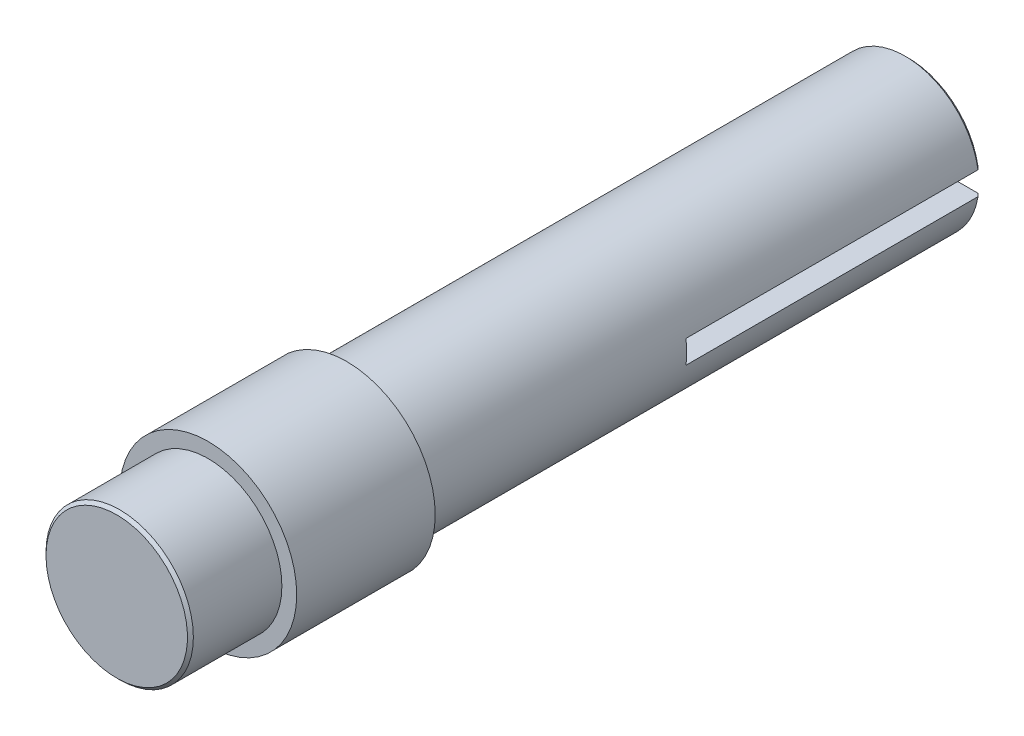
ISO-10303-21;
HEADER;
FILE_DESCRIPTION(('STEP AP214'),'2;1');
FILE_NAME('part.step','',(''),(''),'','','');
FILE_SCHEMA(('AUTOMOTIVE_DESIGN { 1 0 10303 214 1 1 1 1 }'));
ENDSEC;
DATA;
#1=APPLICATION_CONTEXT('core data for automotive mechanical design processes');
#2=APPLICATION_PROTOCOL_DEFINITION('international standard','automotive_design',2000,#1);
#3=PRODUCT_CONTEXT('',#1,'mechanical');
#4=PRODUCT('Part','Part','',(#3));
#5=PRODUCT_RELATED_PRODUCT_CATEGORY('part','',(#4));
#6=PRODUCT_DEFINITION_FORMATION('','',#4);
#7=PRODUCT_DEFINITION_CONTEXT('part definition',#1,'design');
#8=PRODUCT_DEFINITION('design','',#6,#7);
#9=PRODUCT_DEFINITION_SHAPE('','',#8);
#10=(LENGTH_UNIT() NAMED_UNIT(*) SI_UNIT(.MILLI.,.METRE.));
#11=(NAMED_UNIT(*) PLANE_ANGLE_UNIT() SI_UNIT($,.RADIAN.));
#12=(NAMED_UNIT(*) SI_UNIT($,.STERADIAN.) SOLID_ANGLE_UNIT());
#13=UNCERTAINTY_MEASURE_WITH_UNIT(LENGTH_MEASURE(1.E-05),#10,'distance_accuracy_value','');
#14=(GEOMETRIC_REPRESENTATION_CONTEXT(3) GLOBAL_UNCERTAINTY_ASSIGNED_CONTEXT((#13)) GLOBAL_UNIT_ASSIGNED_CONTEXT((#10,
#11,#12)) REPRESENTATION_CONTEXT('',''));
#15=CARTESIAN_POINT('',(0.,0.,0.));
#16=DIRECTION('',(0.,0.,1.));
#17=DIRECTION('',(1.,0.,0.));
#18=AXIS2_PLACEMENT_3D('',#15,#16,#17);
#19=CARTESIAN_POINT('',(0.,0.,68.1355));
#20=DIRECTION('',(0.,0.,1.));
#21=DIRECTION('',(1.,0.,0.));
#22=AXIS2_PLACEMENT_3D('',#19,#20,#21);
#23=PLANE('',#22);
#24=CARTESIAN_POINT('',(0.,0.,68.1354999999257));
#25=DIRECTION('',(0.,0.,-1.));
#26=DIRECTION('',(-1.,0.,0.));
#27=AXIS2_PLACEMENT_3D('',#24,#25,#26);
#28=CIRCLE('',#27,6.08965000003536);
#29=CARTESIAN_POINT('',(-6.08965000003536,0.,68.1354999999257));
#30=VERTEX_POINT('',#29);
#31=EDGE_CURVE('E19',#30,#30,#28,.T.);
#32=ORIENTED_EDGE('',*,*,#31,.F.);
#33=EDGE_LOOP('',(#32));
#34=FACE_BOUND('',#33,.T.);
#35=ADVANCED_FACE('F16',(#34),#23,.T.);
#36=CARTESIAN_POINT('',(0.,0.,67.8815000000554));
#37=DIRECTION('',(0.,0.,-1.));
#38=DIRECTION('',(-1.,0.,0.));
#39=AXIS2_PLACEMENT_3D('',#36,#37,#38);
#40=CONICAL_SURFACE('',#39,6.34364999990567,0.785398163397448);
#41=ORIENTED_EDGE('',*,*,#31,.T.);
#42=EDGE_LOOP('',(#41));
#43=FACE_BOUND('',#42,.T.);
#44=CARTESIAN_POINT('',(0.,0.,67.8815));
#45=DIRECTION('',(0.,0.,1.));
#46=DIRECTION('',(1.,0.,0.));
#47=AXIS2_PLACEMENT_3D('',#44,#45,#46);
#48=CIRCLE('',#47,6.34365);
#49=CARTESIAN_POINT('',(6.34365,0.,67.8815));
#50=VERTEX_POINT('',#49);
#51=EDGE_CURVE('E103',#50,#50,#48,.F.);
#52=ORIENTED_EDGE('',*,*,#51,.F.);
#53=EDGE_LOOP('',(#52));
#54=FACE_BOUND('',#53,.T.);
#55=ADVANCED_FACE('F469',(#43,#54),#40,.T.);
#56=CARTESIAN_POINT('',(0.,0.,60.2615));
#57=DIRECTION('',(0.,0.,1.));
#58=DIRECTION('',(1.,0.,0.));
#59=AXIS2_PLACEMENT_3D('',#56,#57,#58);
#60=CYLINDRICAL_SURFACE('',#59,6.34365);
#61=CARTESIAN_POINT('',(0.,0.,60.2615));
#62=DIRECTION('',(0.,0.,1.));
#63=DIRECTION('',(1.,0.,0.));
#64=AXIS2_PLACEMENT_3D('',#61,#62,#63);
#65=CIRCLE('',#64,6.34365);
#66=CARTESIAN_POINT('',(6.34365,0.,60.2615));
#67=VERTEX_POINT('',#66);
#68=EDGE_CURVE('E257',#67,#67,#65,.F.);
#69=ORIENTED_EDGE('',*,*,#68,.F.);
#70=EDGE_LOOP('',(#69));
#71=FACE_BOUND('',#70,.T.);
#72=ORIENTED_EDGE('',*,*,#51,.T.);
#73=EDGE_LOOP('',(#72));
#74=FACE_BOUND('',#73,.T.);
#75=ADVANCED_FACE('F246',(#71,#74),#60,.T.);
#76=CARTESIAN_POINT('',(0.,0.,0.));
#77=DIRECTION('',(0.,0.,-1.));
#78=DIRECTION('',(-1.,0.,0.));
#79=AXIS2_PLACEMENT_3D('',#76,#77,#78);
#80=CONICAL_SURFACE('',#79,4.24180000004526,0.785398163397448);
#81=CARTESIAN_POINT('',(0.,0.,0.));
#82=DIRECTION('',(0.,0.,-1.));
#83=DIRECTION('',(-1.,0.,0.));
#84=AXIS2_PLACEMENT_3D('',#81,#82,#83);
#85=CIRCLE('',#84,4.24180000004526);
#86=CARTESIAN_POINT('',(4.12224056070739,-0.999999999999999,5.04555482413226E-12));
#87=VERTEX_POINT('',#86);
#88=CARTESIAN_POINT('',(-4.12224056070739,-0.999999999999999,5.04564364376599E-12));
#89=VERTEX_POINT('',#88);
#90=EDGE_CURVE('E97',#87,#89,#85,.T.);
#91=ORIENTED_EDGE('',*,*,#90,.T.);
#92=CARTESIAN_POINT('',(-3.86038195523382,-0.999999999993576,0.254000000000811));
#93=CARTESIAN_POINT('',(-3.90406608771924,-0.999999999996787,0.211708967101962));
#94=CARTESIAN_POINT('',(-3.94772970457568,-0.999999999998928,0.169396783833055));
#95=CARTESIAN_POINT('',(-4.03501590639787,-1.00000000000107,0.0847301171688703));
#96=CARTESIAN_POINT('',(-4.07863849136422,-1.00000000000107,0.042375633774205));
#97=CARTESIAN_POINT('',(-4.12224056070219,-0.999999999999999,1.00961965345783E-11));
#98=B_SPLINE_CURVE_WITH_KNOTS('',3,(#92,#93,#94,#95,#96,#97),.UNSPECIFIED.,.F.,.F.,(4,2,4),(0.,
0.182404743934218,0.364809485223962),.UNSPECIFIED.);
#99=CARTESIAN_POINT('',(-3.86038195521659,-0.999999999999999,0.25400000000233));
#100=VERTEX_POINT('',#99);
#101=EDGE_CURVE('E91',#100,#89,#98,.T.);
#102=ORIENTED_EDGE('',*,*,#101,.F.);
#103=CARTESIAN_POINT('',(0.,0.,0.25399999999999));
#104=DIRECTION('',(0.,0.,-1.));
#105=DIRECTION('',(-1.,0.,0.));
#106=AXIS2_PLACEMENT_3D('',#103,#104,#105);
#107=CIRCLE('',#106,3.9878);
#108=CARTESIAN_POINT('',(3.86038195521659,-0.999999999999999,0.25400000000233));
#109=VERTEX_POINT('',#108);
#110=EDGE_CURVE('E94',#100,#109,#107,.F.);
#111=ORIENTED_EDGE('',*,*,#110,.T.);
#112=CARTESIAN_POINT('',(4.12224056069958,-0.999999999995552,7.39641308948803E-12));
#113=CARTESIAN_POINT('',(4.0786384913623,-0.999999999997775,0.0423756337722108));
#114=CARTESIAN_POINT('',(4.03501590639682,-0.999999999999258,0.0847301171677749));
#115=CARTESIAN_POINT('',(3.94772970457674,-1.00000000000074,0.169396783834143));
#116=CARTESIAN_POINT('',(3.90406608772155,-1.00000000000074,0.211708967104335));
#117=CARTESIAN_POINT('',(3.86038195523756,-0.999999999999999,0.254000000004662));
#118=B_SPLINE_CURVE_WITH_KNOTS('',3,(#112,#113,#114,#115,#116,#117),.UNSPECIFIED.,.F.,.F.,(4,2,
4),(0.,0.182404741289746,0.364809485223961),.UNSPECIFIED.);
#119=EDGE_CURVE('E102',#87,#109,#118,.T.);
#120=ORIENTED_EDGE('',*,*,#119,.F.);
#121=EDGE_LOOP('',(#91,#102,#111,#120));
#122=FACE_BOUND('',#121,.T.);
#123=ADVANCED_FACE('F93',(#122),#80,.F.);
#124=CARTESIAN_POINT('',(0.,0.,60.2615));
#125=DIRECTION('',(0.,0.,1.));
#126=DIRECTION('',(1.,0.,0.));
#127=AXIS2_PLACEMENT_3D('',#124,#125,#126);
#128=PLANE('',#127);
#129=CARTESIAN_POINT('',(0.,0.,60.2615));
#130=DIRECTION('',(0.,0.,-1.));
#131=DIRECTION('',(-1.,0.,0.));
#132=AXIS2_PLACEMENT_3D('',#129,#130,#131);
#133=CIRCLE('',#132,7.62);
#134=CARTESIAN_POINT('',(-7.62,0.,60.2615));
#135=VERTEX_POINT('',#134);
#136=EDGE_CURVE('E210',#135,#135,#133,.T.);
#137=ORIENTED_EDGE('',*,*,#136,.F.);
#138=EDGE_LOOP('',(#137));
#139=FACE_BOUND('',#138,.T.);
#140=ORIENTED_EDGE('',*,*,#68,.T.);
#141=EDGE_LOOP('',(#140));
#142=FACE_BOUND('',#141,.T.);
#143=ADVANCED_FACE('F238',(#139,#142),#128,.T.);
#144=CARTESIAN_POINT('',(0.,0.,28.575));
#145=DIRECTION('',(0.,0.,-1.));
#146=DIRECTION('',(-1.,0.,0.));
#147=AXIS2_PLACEMENT_3D('',#144,#145,#146);
#148=PLANE('',#147);
#149=CARTESIAN_POINT('',(0.,0.,28.575));
#150=DIRECTION('',(0.,0.,-1.));
#151=DIRECTION('',(-1.,0.,0.));
#152=AXIS2_PLACEMENT_3D('',#149,#150,#151);
#153=CIRCLE('',#152,3.9878);
#154=CARTESIAN_POINT('',(-3.9878,0.,28.575));
#155=VERTEX_POINT('',#154);
#156=EDGE_CURVE('E202',#155,#155,#153,.T.);
#157=ORIENTED_EDGE('',*,*,#156,.T.);
#158=EDGE_LOOP('',(#157));
#159=FACE_BOUND('',#158,.T.);
#160=ADVANCED_FACE('F232',(#159),#148,.T.);
#161=CARTESIAN_POINT('',(0.,0.,0.));
#162=DIRECTION('',(0.,0.,-1.));
#163=DIRECTION('',(-1.,0.,0.));
#164=AXIS2_PLACEMENT_3D('',#161,#162,#163);
#165=CONICAL_SURFACE('',#164,4.24180000004526,0.785398163397448);
#166=CARTESIAN_POINT('',(0.,0.,0.));
#167=DIRECTION('',(0.,0.,-1.));
#168=DIRECTION('',(-1.,0.,0.));
#169=AXIS2_PLACEMENT_3D('',#166,#167,#168);
#170=CIRCLE('',#169,4.24180000004526);
#171=CARTESIAN_POINT('',(-4.12224056070739,1.,5.04557822775395E-12));
#172=VERTEX_POINT('',#171);
#173=CARTESIAN_POINT('',(4.12224056070739,0.999999999999998,5.04566130836449E-12));
#174=VERTEX_POINT('',#173);
#175=EDGE_CURVE('E199',#172,#174,#170,.T.);
#176=ORIENTED_EDGE('',*,*,#175,.T.);
#177=CARTESIAN_POINT('',(3.86038195523382,0.999999999993575,0.254000000000811));
#178=CARTESIAN_POINT('',(3.90406608771924,0.999999999996787,0.211708967101961));
#179=CARTESIAN_POINT('',(3.94772970457568,0.999999999998927,0.169396783833055));
#180=CARTESIAN_POINT('',(4.03501590639787,1.00000000000107,0.0847301171688699));
#181=CARTESIAN_POINT('',(4.07863849136422,1.00000000000107,0.042375633774205));
#182=CARTESIAN_POINT('',(4.12224056070219,0.999999999999998,1.00966775679742E-11));
#183=B_SPLINE_CURVE_WITH_KNOTS('',3,(#177,#178,#179,#180,#181,#182),.UNSPECIFIED.,.F.,.F.,(4,2,
4),(0.,0.182404743934218,0.364809485223961),.UNSPECIFIED.);
#184=CARTESIAN_POINT('',(3.86038195521659,0.999999999999998,0.254000000002329));
#185=VERTEX_POINT('',#184);
#186=EDGE_CURVE('E220',#185,#174,#183,.T.);
#187=ORIENTED_EDGE('',*,*,#186,.F.);
#188=CARTESIAN_POINT('',(0.,0.,0.25399999999999));
#189=DIRECTION('',(0.,0.,-1.));
#190=DIRECTION('',(-1.,0.,0.));
#191=AXIS2_PLACEMENT_3D('',#188,#189,#190);
#192=CIRCLE('',#191,3.9878);
#193=CARTESIAN_POINT('',(-3.86038195521659,1.,0.25400000000233));
#194=VERTEX_POINT('',#193);
#195=EDGE_CURVE('E205',#185,#194,#192,.F.);
#196=ORIENTED_EDGE('',*,*,#195,.T.);
#197=CARTESIAN_POINT('',(-4.12224056069958,0.999999999995553,7.39622466692726E-12));
#198=CARTESIAN_POINT('',(-4.0786384913623,0.999999999997776,0.0423756337722106));
#199=CARTESIAN_POINT('',(-4.03501590639682,0.999999999999258,0.0847301171677748));
#200=CARTESIAN_POINT('',(-3.94772970457674,1.00000000000074,0.169396783834143));
#201=CARTESIAN_POINT('',(-3.90406608772155,1.00000000000074,0.211708967104334));
#202=CARTESIAN_POINT('',(-3.86038195523756,1.,0.254000000004661));
#203=B_SPLINE_CURVE_WITH_KNOTS('',3,(#197,#198,#199,#200,#201,#202),.UNSPECIFIED.,.F.,.F.,(4,2,
4),(0.,0.182404741289746,0.36480948522396),.UNSPECIFIED.);
#204=EDGE_CURVE('E110',#172,#194,#203,.T.);
#205=ORIENTED_EDGE('',*,*,#204,.F.);
#206=EDGE_LOOP('',(#176,#187,#196,#205));
#207=FACE_BOUND('',#206,.T.);
#208=ADVANCED_FACE('F226',(#207),#165,.F.);
#209=CARTESIAN_POINT('',(0.,0.,0.));
#210=DIRECTION('',(0.,0.,1.));
#211=DIRECTION('',(1.,0.,0.));
#212=AXIS2_PLACEMENT_3D('',#209,#210,#211);
#213=PLANE('',#212);
#214=DIRECTION('',(1.,0.,0.));
#215=VECTOR('',#214,1.);
#216=CARTESIAN_POINT('',(12.7,-0.999999999999999,0.));
#217=LINE('',#216,#215);
#218=CARTESIAN_POINT('',(-6.00698236401157,-0.999999999999999,0.));
#219=VERTEX_POINT('',#218);
#220=EDGE_CURVE('E117',#219,#89,#217,.T.);
#221=ORIENTED_EDGE('',*,*,#220,.T.);
#222=ORIENTED_EDGE('',*,*,#90,.F.);
#223=DIRECTION('',(1.,0.,0.));
#224=VECTOR('',#223,1.);
#225=CARTESIAN_POINT('',(12.7,-0.999999999999999,0.));
#226=LINE('',#225,#224);
#227=CARTESIAN_POINT('',(6.00698236401157,-0.999999999999999,0.));
#228=VERTEX_POINT('',#227);
#229=EDGE_CURVE('E178',#87,#228,#226,.T.);
#230=ORIENTED_EDGE('',*,*,#229,.T.);
#231=CARTESIAN_POINT('',(0.,0.,0.));
#232=DIRECTION('',(0.,0.,1.));
#233=DIRECTION('',(1.,0.,0.));
#234=AXIS2_PLACEMENT_3D('',#231,#232,#233);
#235=CIRCLE('',#234,6.08964999992168);
#236=EDGE_CURVE('E179',#219,#228,#235,.T.);
#237=ORIENTED_EDGE('',*,*,#236,.F.);
#238=EDGE_LOOP('',(#221,#222,#230,#237));
#239=FACE_BOUND('',#238,.T.);
#240=ADVANCED_FACE('F231',(#239),#213,.F.);
#241=CARTESIAN_POINT('',(0.,0.,68.1355));
#242=DIRECTION('',(0.,0.,-1.));
#243=DIRECTION('',(-1.,0.,0.));
#244=AXIS2_PLACEMENT_3D('',#241,#242,#243);
#245=CYLINDRICAL_SURFACE('',#244,7.62);
#246=CARTESIAN_POINT('',(0.,0.,48.3362));
#247=DIRECTION('',(0.,0.,-1.));
#248=DIRECTION('',(-1.,0.,0.));
#249=AXIS2_PLACEMENT_3D('',#246,#247,#248);
#250=CIRCLE('',#249,7.62);
#251=CARTESIAN_POINT('',(-7.62,0.,48.3362));
#252=VERTEX_POINT('',#251);
#253=EDGE_CURVE('E164',#252,#252,#250,.F.);
#254=ORIENTED_EDGE('',*,*,#253,.T.);
#255=EDGE_LOOP('',(#254));
#256=FACE_BOUND('',#255,.T.);
#257=ORIENTED_EDGE('',*,*,#136,.T.);
#258=EDGE_LOOP('',(#257));
#259=FACE_BOUND('',#258,.T.);
#260=ADVANCED_FACE('F421',(#256,#259),#245,.T.);
#261=CARTESIAN_POINT('',(0.,0.,25.4));
#262=DIRECTION('',(0.,0.,-1.));
#263=DIRECTION('',(-1.,0.,0.));
#264=AXIS2_PLACEMENT_3D('',#261,#262,#263);
#265=PLANE('',#264);
#266=DIRECTION('',(-1.,0.,0.));
#267=VECTOR('',#266,1.);
#268=CARTESIAN_POINT('',(12.7,0.999999999999996,25.4));
#269=LINE('',#268,#267);
#270=CARTESIAN_POINT('',(3.86038195519563,0.999999999999998,25.4));
#271=VERTEX_POINT('',#270);
#272=CARTESIAN_POINT('',(6.2643351859954,0.999999999999997,25.4));
#273=VERTEX_POINT('',#272);
#274=EDGE_CURVE('E277',#271,#273,#269,.F.);
#275=ORIENTED_EDGE('',*,*,#274,.T.);
#276=CARTESIAN_POINT('',(0.,0.,25.4));
#277=DIRECTION('',(0.,0.,-1.));
#278=DIRECTION('',(-1.,0.,0.));
#279=AXIS2_PLACEMENT_3D('',#276,#277,#278);
#280=CIRCLE('',#279,6.34365);
#281=CARTESIAN_POINT('',(6.2643351859954,-0.999999999999998,25.4));
#282=VERTEX_POINT('',#281);
#283=EDGE_CURVE('E208',#273,#282,#280,.T.);
#284=ORIENTED_EDGE('',*,*,#283,.T.);
#285=DIRECTION('',(1.,0.,0.));
#286=VECTOR('',#285,1.);
#287=CARTESIAN_POINT('',(12.7,-0.999999999999999,25.4));
#288=LINE('',#287,#286);
#289=CARTESIAN_POINT('',(3.86038195519563,-0.999999999999999,25.4));
#290=VERTEX_POINT('',#289);
#291=EDGE_CURVE('E168',#282,#290,#288,.F.);
#292=ORIENTED_EDGE('',*,*,#291,.T.);
#293=CARTESIAN_POINT('',(0.,0.,25.4));
#294=DIRECTION('',(0.,0.,-1.));
#295=DIRECTION('',(-1.,0.,0.));
#296=AXIS2_PLACEMENT_3D('',#293,#294,#295);
#297=CIRCLE('',#296,3.9878);
#298=EDGE_CURVE('E206',#290,#271,#297,.F.);
#299=ORIENTED_EDGE('',*,*,#298,.T.);
#300=EDGE_LOOP('',(#275,#284,#292,#299));
#301=FACE_BOUND('',#300,.T.);
#302=ADVANCED_FACE('F327',(#301),#265,.T.);
#303=CARTESIAN_POINT('',(0.,0.,28.575));
#304=DIRECTION('',(0.,0.,-1.));
#305=DIRECTION('',(-1.,0.,0.));
#306=AXIS2_PLACEMENT_3D('',#303,#304,#305);
#307=CYLINDRICAL_SURFACE('',#306,3.9878);
#308=ORIENTED_EDGE('',*,*,#156,.F.);
#309=EDGE_LOOP('',(#308));
#310=FACE_BOUND('',#309,.T.);
#311=CARTESIAN_POINT('',(0.,0.,25.4));
#312=DIRECTION('',(0.,0.,-1.));
#313=DIRECTION('',(-1.,0.,0.));
#314=AXIS2_PLACEMENT_3D('',#311,#312,#313);
#315=CIRCLE('',#314,3.9878);
#316=CARTESIAN_POINT('',(-3.86038195519563,1.,25.4));
#317=VERTEX_POINT('',#316);
#318=CARTESIAN_POINT('',(-3.86038195519563,-0.999999999999999,25.4));
#319=VERTEX_POINT('',#318);
#320=EDGE_CURVE('E119',#317,#319,#315,.F.);
#321=ORIENTED_EDGE('',*,*,#320,.F.);
#322=DIRECTION('',(0.,0.,1.));
#323=VECTOR('',#322,1.);
#324=CARTESIAN_POINT('',(-3.86038195519563,1.,25.4));
#325=LINE('',#324,#323);
#326=EDGE_CURVE('E311',#317,#194,#325,.F.);
#327=ORIENTED_EDGE('',*,*,#326,.T.);
#328=ORIENTED_EDGE('',*,*,#195,.F.);
#329=DIRECTION('',(0.,0.,1.));
#330=VECTOR('',#329,1.);
#331=CARTESIAN_POINT('',(3.86038195519563,0.999999999999998,25.4));
#332=LINE('',#331,#330);
#333=EDGE_CURVE('E167',#185,#271,#332,.T.);
#334=ORIENTED_EDGE('',*,*,#333,.T.);
#335=ORIENTED_EDGE('',*,*,#298,.F.);
#336=DIRECTION('',(0.,0.,1.));
#337=VECTOR('',#336,1.);
#338=CARTESIAN_POINT('',(3.86038195519563,-0.999999999999999,25.4));
#339=LINE('',#338,#337);
#340=EDGE_CURVE('E109',#290,#109,#339,.F.);
#341=ORIENTED_EDGE('',*,*,#340,.T.);
#342=ORIENTED_EDGE('',*,*,#110,.F.);
#343=DIRECTION('',(0.,0.,1.));
#344=VECTOR('',#343,1.);
#345=CARTESIAN_POINT('',(-3.86038195519563,-0.999999999999999,25.4));
#346=LINE('',#345,#344);
#347=EDGE_CURVE('E106',#100,#319,#346,.T.);
#348=ORIENTED_EDGE('',*,*,#347,.T.);
#349=EDGE_LOOP('',(#321,#327,#328,#334,#335,#341,#342,#348));
#350=FACE_BOUND('',#349,.T.);
#351=ADVANCED_FACE('F105',(#310,#350),#307,.F.);
#352=CARTESIAN_POINT('',(0.,0.,0.));
#353=DIRECTION('',(0.,0.,1.));
#354=DIRECTION('',(1.,0.,0.));
#355=AXIS2_PLACEMENT_3D('',#352,#353,#354);
#356=PLANE('',#355);
#357=DIRECTION('',(-1.,0.,0.));
#358=VECTOR('',#357,1.);
#359=CARTESIAN_POINT('',(12.7,0.999999999999996,0.));
#360=LINE('',#359,#358);
#361=CARTESIAN_POINT('',(6.00698236401157,0.999999999999997,0.));
#362=VERTEX_POINT('',#361);
#363=EDGE_CURVE('E163',#362,#174,#360,.T.);
#364=ORIENTED_EDGE('',*,*,#363,.T.);
#365=ORIENTED_EDGE('',*,*,#175,.F.);
#366=DIRECTION('',(-1.,0.,0.));
#367=VECTOR('',#366,1.);
#368=CARTESIAN_POINT('',(12.7,0.999999999999996,0.));
#369=LINE('',#368,#367);
#370=CARTESIAN_POINT('',(-6.00698236401157,1.,0.));
#371=VERTEX_POINT('',#370);
#372=EDGE_CURVE('E141',#172,#371,#369,.T.);
#373=ORIENTED_EDGE('',*,*,#372,.T.);
#374=CARTESIAN_POINT('',(0.,0.,0.));
#375=DIRECTION('',(0.,0.,1.));
#376=DIRECTION('',(1.,0.,0.));
#377=AXIS2_PLACEMENT_3D('',#374,#375,#376);
#378=CIRCLE('',#377,6.08964999992168);
#379=EDGE_CURVE('E142',#362,#371,#378,.T.);
#380=ORIENTED_EDGE('',*,*,#379,.F.);
#381=EDGE_LOOP('',(#364,#365,#373,#380));
#382=FACE_BOUND('',#381,.T.);
#383=ADVANCED_FACE('F275',(#382),#356,.F.);
#384=CARTESIAN_POINT('',(0.,0.,25.4));
#385=DIRECTION('',(0.,0.,-1.));
#386=DIRECTION('',(-1.,0.,0.));
#387=AXIS2_PLACEMENT_3D('',#384,#385,#386);
#388=PLANE('',#387);
#389=DIRECTION('',(1.,0.,0.));
#390=VECTOR('',#389,1.);
#391=CARTESIAN_POINT('',(12.7,-0.999999999999999,25.4));
#392=LINE('',#391,#390);
#393=CARTESIAN_POINT('',(-6.2643351859954,-1.,25.4));
#394=VERTEX_POINT('',#393);
#395=EDGE_CURVE('E115',#319,#394,#392,.F.);
#396=ORIENTED_EDGE('',*,*,#395,.T.);
#397=CARTESIAN_POINT('',(0.,0.,25.4));
#398=DIRECTION('',(0.,0.,-1.));
#399=DIRECTION('',(-1.,0.,0.));
#400=AXIS2_PLACEMENT_3D('',#397,#398,#399);
#401=CIRCLE('',#400,6.34365);
#402=CARTESIAN_POINT('',(-6.2643351859954,1.,25.4));
#403=VERTEX_POINT('',#402);
#404=EDGE_CURVE('E34',#394,#403,#401,.T.);
#405=ORIENTED_EDGE('',*,*,#404,.T.);
#406=DIRECTION('',(-1.,0.,0.));
#407=VECTOR('',#406,1.);
#408=CARTESIAN_POINT('',(12.7,0.999999999999996,25.4));
#409=LINE('',#408,#407);
#410=EDGE_CURVE('E140',#403,#317,#409,.F.);
#411=ORIENTED_EDGE('',*,*,#410,.T.);
#412=ORIENTED_EDGE('',*,*,#320,.T.);
#413=EDGE_LOOP('',(#396,#405,#411,#412));
#414=FACE_BOUND('',#413,.T.);
#415=ADVANCED_FACE('F389',(#414),#388,.T.);
#416=CARTESIAN_POINT('',(12.7,-0.999999999999999,25.4));
#417=DIRECTION('',(0.,-1.,0.));
#418=DIRECTION('',(1.,0.,0.));
#419=AXIS2_PLACEMENT_3D('',#416,#417,#418);
#420=PLANE('',#419);
#421=ORIENTED_EDGE('',*,*,#220,.F.);
#422=CARTESIAN_POINT('',(-6.26433518600098,-0.999999999999999,0.254000000026993));
#423=CARTESIAN_POINT('',(-6.22145453918382,-0.999999999999999,0.211655024874562));
#424=CARTESIAN_POINT('',(-6.17856814728559,-0.999999999999999,0.16931587063877));
#425=CARTESIAN_POINT('',(-6.09278387329471,-0.999999999999999,0.0846492039686032));
#426=CARTESIAN_POINT('',(-6.04988599120206,-0.999999999999999,0.0423216915342381));
#427=CARTESIAN_POINT('',(-6.00698236402832,-0.999999999999999,1.6519060970673E-11));
#428=B_SPLINE_CURVE_WITH_KNOTS('',3,(#422,#423,#424,#425,#426,#427),.UNSPECIFIED.,.F.,.F.,(4,2,
4),(0.,0.180794411758377,0.361588823652802),.UNSPECIFIED.);
#429=CARTESIAN_POINT('',(-6.26433518599819,-0.999999999999999,0.254000000013498));
#430=VERTEX_POINT('',#429);
#431=EDGE_CURVE('E191',#430,#219,#428,.T.);
#432=ORIENTED_EDGE('',*,*,#431,.F.);
#433=DIRECTION('',(0.,0.,-1.));
#434=VECTOR('',#433,1.);
#435=CARTESIAN_POINT('',(-6.2643351859954,-1.,81.814114690566));
#436=LINE('',#435,#434);
#437=EDGE_CURVE('E122',#394,#430,#436,.T.);
#438=ORIENTED_EDGE('',*,*,#437,.F.);
#439=ORIENTED_EDGE('',*,*,#395,.F.);
#440=ORIENTED_EDGE('',*,*,#347,.F.);
#441=ORIENTED_EDGE('',*,*,#101,.T.);
#442=EDGE_LOOP('',(#421,#432,#438,#439,#440,#441));
#443=FACE_BOUND('',#442,.T.);
#444=ADVANCED_FACE('F113',(#443),#420,.F.);
#445=CARTESIAN_POINT('',(0.,0.,0.254000000040833));
#446=DIRECTION('',(0.,0.,1.));
#447=DIRECTION('',(1.,0.,0.));
#448=AXIS2_PLACEMENT_3D('',#445,#446,#447);
#449=CONICAL_SURFACE('',#448,6.34365000001935,0.785398163509345);
#450=ORIENTED_EDGE('',*,*,#431,.T.);
#451=ORIENTED_EDGE('',*,*,#236,.T.);
#452=CARTESIAN_POINT('',(6.00698236403224,-0.999999999999999,2.03824723070305E-11));
#453=CARTESIAN_POINT('',(6.04988599120428,-0.999999999999999,0.0423216915364305));
#454=CARTESIAN_POINT('',(6.09278387329524,-0.999999999999999,0.0846492039691241));
#455=CARTESIAN_POINT('',(6.17856814728273,-0.999999999999999,0.169315870635947));
#456=CARTESIAN_POINT('',(6.22145453917927,-0.999999999999999,0.211655024870067));
#457=CARTESIAN_POINT('',(6.26433518599473,-0.999999999999999,0.254000000020824));
#458=B_SPLINE_CURVE_WITH_KNOTS('',3,(#452,#453,#454,#455,#456,#457),.UNSPECIFIED.,.F.,.F.,(4,2,
4),(0.,0.180794411887285,0.361588823638523),.UNSPECIFIED.);
#459=CARTESIAN_POINT('',(6.26433518599507,-0.999999999999998,0.254000000010414));
#460=VERTEX_POINT('',#459);
#461=EDGE_CURVE('E169',#228,#460,#458,.T.);
#462=ORIENTED_EDGE('',*,*,#461,.T.);
#463=CARTESIAN_POINT('',(0.,0.,0.254000000000004));
#464=DIRECTION('',(0.,0.,-1.));
#465=DIRECTION('',(-1.,0.,0.));
#466=AXIS2_PLACEMENT_3D('',#463,#464,#465);
#467=CIRCLE('',#466,6.34365);
#468=EDGE_CURVE('E291',#430,#460,#467,.F.);
#469=ORIENTED_EDGE('',*,*,#468,.F.);
#470=EDGE_LOOP('',(#450,#451,#462,#469));
#471=FACE_BOUND('',#470,.T.);
#472=ADVANCED_FACE('F183',(#471),#449,.T.);
#473=CARTESIAN_POINT('',(12.7,-0.999999999999999,25.4));
#474=DIRECTION('',(0.,-1.,0.));
#475=DIRECTION('',(1.,0.,0.));
#476=AXIS2_PLACEMENT_3D('',#473,#474,#475);
#477=PLANE('',#476);
#478=DIRECTION('',(0.,0.,-1.));
#479=VECTOR('',#478,1.);
#480=CARTESIAN_POINT('',(6.2643351859954,-0.999999999999998,81.814114690566));
#481=LINE('',#480,#479);
#482=EDGE_CURVE('E131',#460,#282,#481,.F.);
#483=ORIENTED_EDGE('',*,*,#482,.F.);
#484=ORIENTED_EDGE('',*,*,#461,.F.);
#485=ORIENTED_EDGE('',*,*,#229,.F.);
#486=ORIENTED_EDGE('',*,*,#119,.T.);
#487=ORIENTED_EDGE('',*,*,#340,.F.);
#488=ORIENTED_EDGE('',*,*,#291,.F.);
#489=EDGE_LOOP('',(#483,#484,#485,#486,#487,#488));
#490=FACE_BOUND('',#489,.T.);
#491=ADVANCED_FACE('F181',(#490),#477,.F.);
#492=CARTESIAN_POINT('',(0.,0.,48.3362));
#493=DIRECTION('',(0.,0.,1.));
#494=DIRECTION('',(1.,0.,0.));
#495=AXIS2_PLACEMENT_3D('',#492,#493,#494);
#496=PLANE('',#495);
#497=CARTESIAN_POINT('',(0.,0.,48.3362));
#498=DIRECTION('',(0.,0.,-1.));
#499=DIRECTION('',(-1.,0.,0.));
#500=AXIS2_PLACEMENT_3D('',#497,#498,#499);
#501=CIRCLE('',#500,6.34365);
#502=CARTESIAN_POINT('',(-6.34365,0.,48.3362));
#503=VERTEX_POINT('',#502);
#504=EDGE_CURVE('E127',#503,#503,#501,.T.);
#505=ORIENTED_EDGE('',*,*,#504,.F.);
#506=EDGE_LOOP('',(#505));
#507=FACE_BOUND('',#506,.T.);
#508=ORIENTED_EDGE('',*,*,#253,.F.);
#509=EDGE_LOOP('',(#508));
#510=FACE_BOUND('',#509,.T.);
#511=ADVANCED_FACE('F360',(#507,#510),#496,.F.);
#512=CARTESIAN_POINT('',(12.7,0.999999999999996,25.4));
#513=DIRECTION('',(0.,1.,0.));
#514=DIRECTION('',(-1.,0.,0.));
#515=AXIS2_PLACEMENT_3D('',#512,#513,#514);
#516=PLANE('',#515);
#517=ORIENTED_EDGE('',*,*,#363,.F.);
#518=CARTESIAN_POINT('',(6.26433518600098,0.999999999999997,0.254000000026992));
#519=CARTESIAN_POINT('',(6.22145453918382,0.999999999999997,0.211655024874562));
#520=CARTESIAN_POINT('',(6.17856814728559,0.999999999999997,0.16931587063877));
#521=CARTESIAN_POINT('',(6.09278387329471,0.999999999999997,0.0846492039686031));
#522=CARTESIAN_POINT('',(6.04988599120205,0.999999999999997,0.0423216915342378));
#523=CARTESIAN_POINT('',(6.00698236402832,0.999999999999997,1.65185976694277E-11));
#524=B_SPLINE_CURVE_WITH_KNOTS('',3,(#518,#519,#520,#521,#522,#523),.UNSPECIFIED.,.F.,.F.,(4,2,
4),(0.,0.180794411758378,0.361588823652803),.UNSPECIFIED.);
#525=CARTESIAN_POINT('',(6.26433518599819,0.999999999999997,0.254000000013498));
#526=VERTEX_POINT('',#525);
#527=EDGE_CURVE('E156',#526,#362,#524,.T.);
#528=ORIENTED_EDGE('',*,*,#527,.F.);
#529=DIRECTION('',(0.,0.,-1.));
#530=VECTOR('',#529,1.);
#531=CARTESIAN_POINT('',(6.2643351859954,0.999999999999996,81.814114690566));
#532=LINE('',#531,#530);
#533=EDGE_CURVE('E130',#273,#526,#532,.T.);
#534=ORIENTED_EDGE('',*,*,#533,.F.);
#535=ORIENTED_EDGE('',*,*,#274,.F.);
#536=ORIENTED_EDGE('',*,*,#333,.F.);
#537=ORIENTED_EDGE('',*,*,#186,.T.);
#538=EDGE_LOOP('',(#517,#528,#534,#535,#536,#537));
#539=FACE_BOUND('',#538,.T.);
#540=ADVANCED_FACE('F151',(#539),#516,.F.);
#541=CARTESIAN_POINT('',(0.,0.,0.254000000040833));
#542=DIRECTION('',(0.,0.,1.));
#543=DIRECTION('',(1.,0.,0.));
#544=AXIS2_PLACEMENT_3D('',#541,#542,#543);
#545=CONICAL_SURFACE('',#544,6.34365000001935,0.785398163509345);
#546=ORIENTED_EDGE('',*,*,#527,.T.);
#547=ORIENTED_EDGE('',*,*,#379,.T.);
#548=CARTESIAN_POINT('',(-6.00698236403224,1.,2.03846149462187E-11));
#549=CARTESIAN_POINT('',(-6.04988599120428,1.,0.0423216915364323));
#550=CARTESIAN_POINT('',(-6.09278387329524,1.,0.0846492039691257));
#551=CARTESIAN_POINT('',(-6.17856814728273,1.,0.169315870635948));
#552=CARTESIAN_POINT('',(-6.22145453917927,1.,0.211655024870068));
#553=CARTESIAN_POINT('',(-6.26433518599473,1.,0.254000000020824));
#554=B_SPLINE_CURVE_WITH_KNOTS('',3,(#548,#549,#550,#551,#552,#553),.UNSPECIFIED.,.F.,.F.,(4,2,
4),(0.,0.180794411887284,0.36158882363852),.UNSPECIFIED.);
#555=CARTESIAN_POINT('',(-6.26433518599507,1.,0.254000000010414));
#556=VERTEX_POINT('',#555);
#557=EDGE_CURVE('E132',#371,#556,#554,.T.);
#558=ORIENTED_EDGE('',*,*,#557,.T.);
#559=CARTESIAN_POINT('',(0.,0.,0.254000000000004));
#560=DIRECTION('',(0.,0.,-1.));
#561=DIRECTION('',(-1.,0.,0.));
#562=AXIS2_PLACEMENT_3D('',#559,#560,#561);
#563=CIRCLE('',#562,6.34365);
#564=EDGE_CURVE('E25',#526,#556,#563,.F.);
#565=ORIENTED_EDGE('',*,*,#564,.F.);
#566=EDGE_LOOP('',(#546,#547,#558,#565));
#567=FACE_BOUND('',#566,.T.);
#568=ADVANCED_FACE('F147',(#567),#545,.T.);
#569=CARTESIAN_POINT('',(12.7,0.999999999999996,25.4));
#570=DIRECTION('',(0.,1.,0.));
#571=DIRECTION('',(-1.,0.,0.));
#572=AXIS2_PLACEMENT_3D('',#569,#570,#571);
#573=PLANE('',#572);
#574=DIRECTION('',(0.,0.,-1.));
#575=VECTOR('',#574,1.);
#576=CARTESIAN_POINT('',(-6.2643351859954,1.,81.814114690566));
#577=LINE('',#576,#575);
#578=EDGE_CURVE('E11',#556,#403,#577,.F.);
#579=ORIENTED_EDGE('',*,*,#578,.F.);
#580=ORIENTED_EDGE('',*,*,#557,.F.);
#581=ORIENTED_EDGE('',*,*,#372,.F.);
#582=ORIENTED_EDGE('',*,*,#204,.T.);
#583=ORIENTED_EDGE('',*,*,#326,.F.);
#584=ORIENTED_EDGE('',*,*,#410,.F.);
#585=EDGE_LOOP('',(#579,#580,#581,#582,#583,#584));
#586=FACE_BOUND('',#585,.T.);
#587=ADVANCED_FACE('F144',(#586),#573,.F.);
#588=CARTESIAN_POINT('',(0.,0.,81.814114690566));
#589=DIRECTION('',(0.,0.,-1.));
#590=DIRECTION('',(-1.,0.,0.));
#591=AXIS2_PLACEMENT_3D('',#588,#589,#590);
#592=CYLINDRICAL_SURFACE('',#591,6.34365);
#593=ORIENTED_EDGE('',*,*,#283,.F.);
#594=ORIENTED_EDGE('',*,*,#533,.T.);
#595=ORIENTED_EDGE('',*,*,#564,.T.);
#596=ORIENTED_EDGE('',*,*,#578,.T.);
#597=ORIENTED_EDGE('',*,*,#404,.F.);
#598=ORIENTED_EDGE('',*,*,#437,.T.);
#599=ORIENTED_EDGE('',*,*,#468,.T.);
#600=ORIENTED_EDGE('',*,*,#482,.T.);
#601=EDGE_LOOP('',(#593,#594,#595,#596,#597,#598,#599,#600));
#602=FACE_BOUND('',#601,.T.);
#603=ORIENTED_EDGE('',*,*,#504,.T.);
#604=EDGE_LOOP('',(#603));
#605=FACE_BOUND('',#604,.T.);
#606=ADVANCED_FACE('F306',(#602,#605),#592,.T.);
#607=CLOSED_SHELL('',(#35,#55,#75,#123,#143,#160,#208,#240,#260,#302,#351,#383,#415,#444,#472,
#491,#511,#540,#568,#587,#606));
#608=MANIFOLD_SOLID_BREP('B1',#607);
#609=ADVANCED_BREP_SHAPE_REPRESENTATION('',(#18,#608),#14);
#610=SHAPE_DEFINITION_REPRESENTATION(#9,#609);
ENDSEC;
END-ISO-10303-21;
